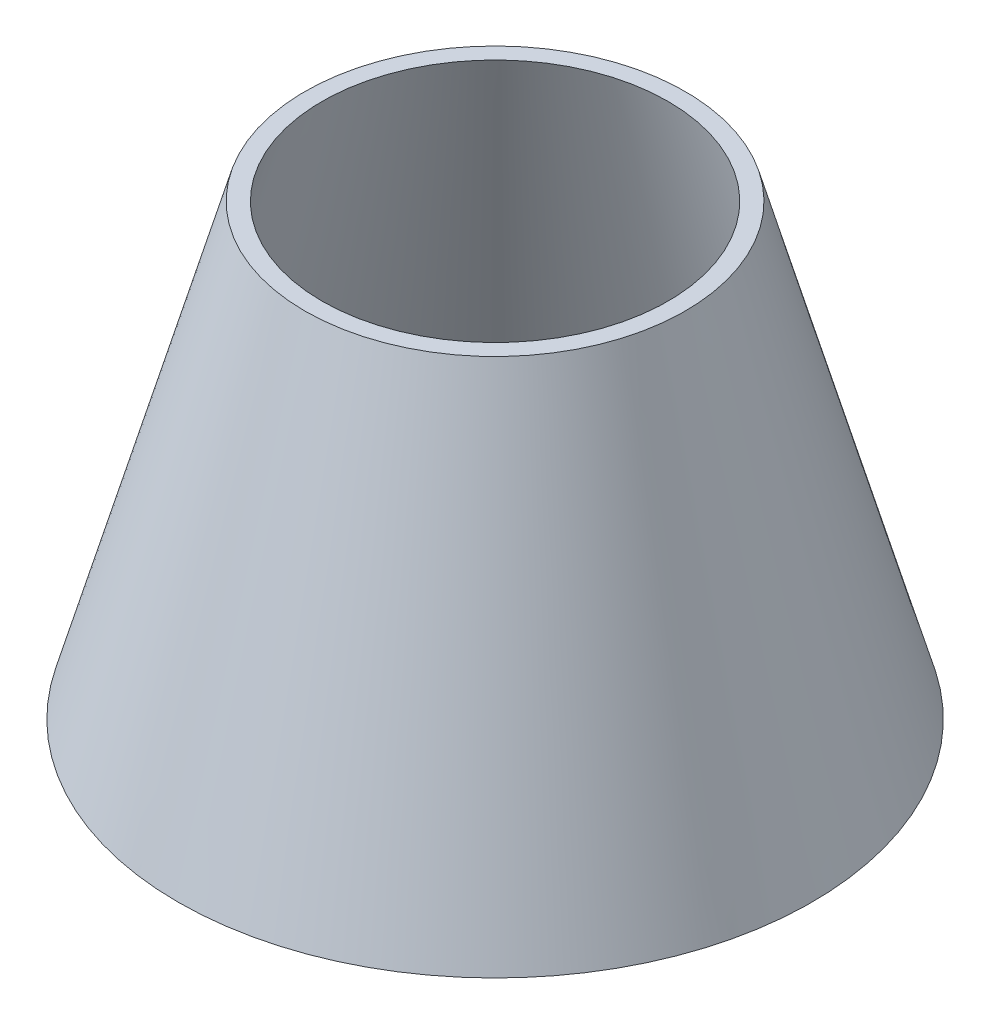
ISO-10303-21;
HEADER;
FILE_DESCRIPTION(('STEP AP214'),'2;1');
FILE_NAME('part.step','',(''),(''),'','','');
FILE_SCHEMA(('AUTOMOTIVE_DESIGN { 1 0 10303 214 1 1 1 1 }'));
ENDSEC;
DATA;
#1=APPLICATION_CONTEXT('core data for automotive mechanical design processes');
#2=APPLICATION_PROTOCOL_DEFINITION('international standard','automotive_design',2000,#1);
#3=PRODUCT_CONTEXT('',#1,'mechanical');
#4=PRODUCT('Part','Part','',(#3));
#5=PRODUCT_RELATED_PRODUCT_CATEGORY('part','',(#4));
#6=PRODUCT_DEFINITION_FORMATION('','',#4);
#7=PRODUCT_DEFINITION_CONTEXT('part definition',#1,'design');
#8=PRODUCT_DEFINITION('design','',#6,#7);
#9=PRODUCT_DEFINITION_SHAPE('','',#8);
#10=(LENGTH_UNIT() NAMED_UNIT(*) SI_UNIT(.MILLI.,.METRE.));
#11=(NAMED_UNIT(*) PLANE_ANGLE_UNIT() SI_UNIT($,.RADIAN.));
#12=(NAMED_UNIT(*) SI_UNIT($,.STERADIAN.) SOLID_ANGLE_UNIT());
#13=UNCERTAINTY_MEASURE_WITH_UNIT(LENGTH_MEASURE(1.E-05),#10,'distance_accuracy_value','');
#14=(GEOMETRIC_REPRESENTATION_CONTEXT(3) GLOBAL_UNCERTAINTY_ASSIGNED_CONTEXT((#13)) GLOBAL_UNIT_ASSIGNED_CONTEXT((#10,
#11,#12)) REPRESENTATION_CONTEXT('',''));
#15=CARTESIAN_POINT('',(0.,0.,0.));
#16=DIRECTION('',(0.,0.,1.));
#17=DIRECTION('',(1.,0.,0.));
#18=AXIS2_PLACEMENT_3D('',#15,#16,#17);
#19=CARTESIAN_POINT('',(0.,0.,0.));
#20=DIRECTION('',(0.,1.,0.));
#21=DIRECTION('',(0.,0.,1.));
#22=AXIS2_PLACEMENT_3D('',#19,#20,#21);
#23=PLANE('',#22);
#24=CARTESIAN_POINT('',(0.,0.,0.));
#25=DIRECTION('',(0.,1.,0.));
#26=DIRECTION('',(0.,0.,1.));
#27=AXIS2_PLACEMENT_3D('',#24,#25,#26);
#28=CIRCLE('',#27,30.0343190298608);
#29=CARTESIAN_POINT('',(0.,0.,30.0343190298608));
#30=VERTEX_POINT('',#29);
#31=EDGE_CURVE('E99',#30,#30,#28,.T.);
#32=ORIENTED_EDGE('',*,*,#31,.T.);
#33=EDGE_LOOP('',(#32));
#34=FACE_BOUND('',#33,.T.);
#35=CARTESIAN_POINT('',(0.,0.,0.));
#36=DIRECTION('',(0.,1.,0.));
#37=DIRECTION('',(0.,0.,1.));
#38=AXIS2_PLACEMENT_3D('',#35,#36,#37);
#39=CIRCLE('',#38,31.75);
#40=CARTESIAN_POINT('',(0.,0.,31.75));
#41=VERTEX_POINT('',#40);
#42=EDGE_CURVE('E38',#41,#41,#39,.T.);
#43=ORIENTED_EDGE('',*,*,#42,.F.);
#44=EDGE_LOOP('',(#43));
#45=FACE_BOUND('',#44,.T.);
#46=ADVANCED_FACE('F30',(#34,#45),#23,.F.);
#47=CARTESIAN_POINT('',(0.,44.9326,0.));
#48=DIRECTION('',(0.,1.,0.));
#49=DIRECTION('',(0.,0.,1.));
#50=AXIS2_PLACEMENT_3D('',#47,#48,#49);
#51=PLANE('',#50);
#52=CARTESIAN_POINT('',(0.,44.9326,0.));
#53=DIRECTION('',(0.,1.,0.));
#54=DIRECTION('',(0.,0.,1.));
#55=AXIS2_PLACEMENT_3D('',#52,#53,#54);
#56=CIRCLE('',#55,17.3343190298608);
#57=CARTESIAN_POINT('',(0.,44.9326,17.3343190298608));
#58=VERTEX_POINT('',#57);
#59=EDGE_CURVE('E44',#58,#58,#56,.T.);
#60=ORIENTED_EDGE('',*,*,#59,.F.);
#61=EDGE_LOOP('',(#60));
#62=FACE_BOUND('',#61,.T.);
#63=CARTESIAN_POINT('',(0.,44.9326,0.));
#64=DIRECTION('',(0.,1.,0.));
#65=DIRECTION('',(0.,0.,1.));
#66=AXIS2_PLACEMENT_3D('',#63,#64,#65);
#67=CIRCLE('',#66,19.05);
#68=CARTESIAN_POINT('',(0.,44.9326,19.05));
#69=VERTEX_POINT('',#68);
#70=EDGE_CURVE('E11',#69,#69,#67,.T.);
#71=ORIENTED_EDGE('',*,*,#70,.T.);
#72=EDGE_LOOP('',(#71));
#73=FACE_BOUND('',#72,.T.);
#74=ADVANCED_FACE('F80',(#62,#73),#51,.T.);
#75=CARTESIAN_POINT('',(0.,44.9326,0.));
#76=DIRECTION('',(0.,-1.,0.));
#77=DIRECTION('',(0.,0.,-1.));
#78=AXIS2_PLACEMENT_3D('',#75,#76,#77);
#79=CONICAL_SURFACE('',#78,19.05,0.275460243487087);
#80=ORIENTED_EDGE('',*,*,#70,.F.);
#81=EDGE_LOOP('',(#80));
#82=FACE_BOUND('',#81,.T.);
#83=ORIENTED_EDGE('',*,*,#42,.T.);
#84=EDGE_LOOP('',(#83));
#85=FACE_BOUND('',#84,.T.);
#86=ADVANCED_FACE('F64',(#82,#85),#79,.T.);
#87=CARTESIAN_POINT('',(0.,44.4835447442614,0.));
#88=DIRECTION('',(0.,-1.,0.));
#89=DIRECTION('',(0.,0.,-1.));
#90=AXIS2_PLACEMENT_3D('',#87,#88,#89);
#91=CONICAL_SURFACE('',#90,17.4612425051967,0.275460243487087);
#92=ORIENTED_EDGE('',*,*,#59,.T.);
#93=EDGE_LOOP('',(#92));
#94=FACE_BOUND('',#93,.T.);
#95=ORIENTED_EDGE('',*,*,#31,.F.);
#96=EDGE_LOOP('',(#95));
#97=FACE_BOUND('',#96,.T.);
#98=ADVANCED_FACE('F79',(#94,#97),#91,.F.);
#99=CLOSED_SHELL('',(#46,#74,#86,#98));
#100=MANIFOLD_SOLID_BREP('B2',#99);
#101=ADVANCED_BREP_SHAPE_REPRESENTATION('',(#18,#100),#14);
#102=SHAPE_DEFINITION_REPRESENTATION(#9,#101);
ENDSEC;
END-ISO-10303-21;
